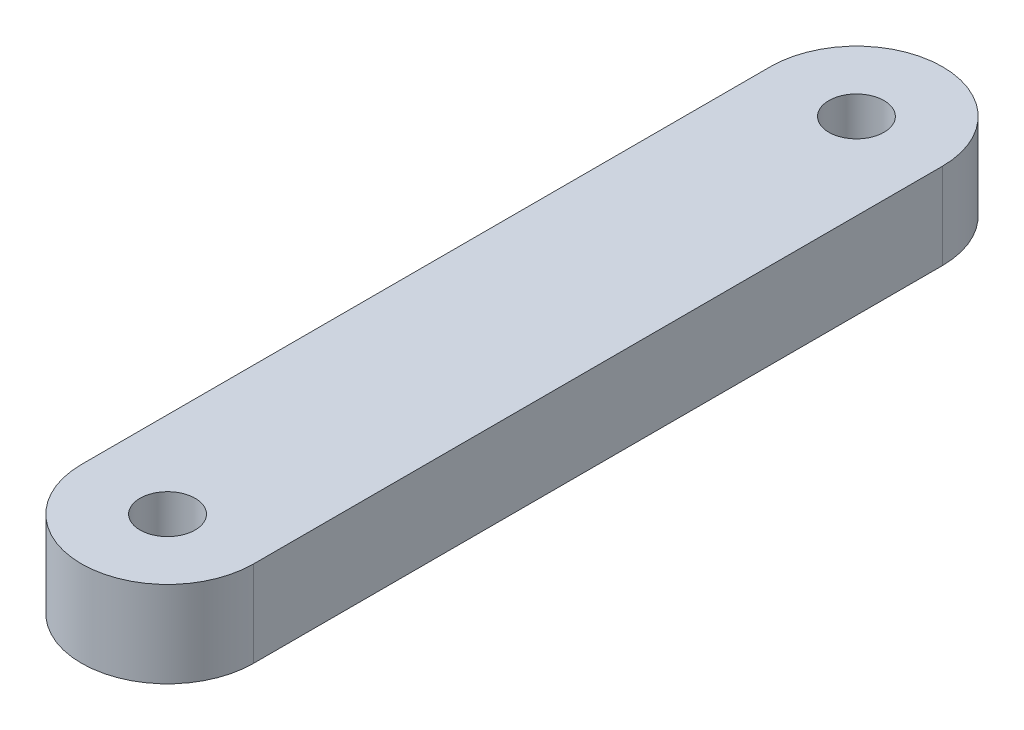
ISO-10303-21;
HEADER;
FILE_DESCRIPTION(('STEP AP214'),'2;1');
FILE_NAME('part.step','',(''),(''),'','','');
FILE_SCHEMA(('AUTOMOTIVE_DESIGN { 1 0 10303 214 1 1 1 1 }'));
ENDSEC;
DATA;
#1=APPLICATION_CONTEXT('core data for automotive mechanical design processes');
#2=APPLICATION_PROTOCOL_DEFINITION('international standard','automotive_design',2000,#1);
#3=PRODUCT_CONTEXT('',#1,'mechanical');
#4=PRODUCT('Part','Part','',(#3));
#5=PRODUCT_RELATED_PRODUCT_CATEGORY('part','',(#4));
#6=PRODUCT_DEFINITION_FORMATION('','',#4);
#7=PRODUCT_DEFINITION_CONTEXT('part definition',#1,'design');
#8=PRODUCT_DEFINITION('design','',#6,#7);
#9=PRODUCT_DEFINITION_SHAPE('','',#8);
#10=(LENGTH_UNIT() NAMED_UNIT(*) SI_UNIT(.MILLI.,.METRE.));
#11=(NAMED_UNIT(*) PLANE_ANGLE_UNIT() SI_UNIT($,.RADIAN.));
#12=(NAMED_UNIT(*) SI_UNIT($,.STERADIAN.) SOLID_ANGLE_UNIT());
#13=UNCERTAINTY_MEASURE_WITH_UNIT(LENGTH_MEASURE(1.E-05),#10,'distance_accuracy_value','');
#14=(GEOMETRIC_REPRESENTATION_CONTEXT(3) GLOBAL_UNCERTAINTY_ASSIGNED_CONTEXT((#13)) GLOBAL_UNIT_ASSIGNED_CONTEXT((#10,
#11,#12)) REPRESENTATION_CONTEXT('',''));
#15=CARTESIAN_POINT('',(0.,0.,0.));
#16=DIRECTION('',(0.,0.,1.));
#17=DIRECTION('',(1.,0.,0.));
#18=AXIS2_PLACEMENT_3D('',#15,#16,#17);
#19=CARTESIAN_POINT('',(0.,5.,0.));
#20=DIRECTION('',(0.,1.,0.));
#21=DIRECTION('',(0.,0.,1.));
#22=AXIS2_PLACEMENT_3D('',#19,#20,#21);
#23=PLANE('',#22);
#24=CARTESIAN_POINT('',(0.,5.,-40.));
#25=DIRECTION('',(0.,1.,0.));
#26=DIRECTION('',(0.,0.,1.));
#27=AXIS2_PLACEMENT_3D('',#24,#25,#26);
#28=CIRCLE('',#27,1.6);
#29=CARTESIAN_POINT('',(0.,5.,-38.4));
#30=VERTEX_POINT('',#29);
#31=EDGE_CURVE('E116',#30,#30,#28,.T.);
#32=ORIENTED_EDGE('',*,*,#31,.F.);
#33=EDGE_LOOP('',(#32));
#34=FACE_BOUND('',#33,.T.);
#35=CARTESIAN_POINT('',(0.,5.,0.));
#36=DIRECTION('',(0.,1.,0.));
#37=DIRECTION('',(0.,0.,1.));
#38=AXIS2_PLACEMENT_3D('',#35,#36,#37);
#39=CIRCLE('',#38,5.);
#40=CARTESIAN_POINT('',(-5.,5.,0.));
#41=VERTEX_POINT('',#40);
#42=CARTESIAN_POINT('',(5.,5.,0.));
#43=VERTEX_POINT('',#42);
#44=EDGE_CURVE('E96',#41,#43,#39,.T.);
#45=ORIENTED_EDGE('',*,*,#44,.T.);
#46=DIRECTION('',(0.,0.,-1.));
#47=VECTOR('',#46,1.);
#48=CARTESIAN_POINT('',(5.,5.,0.));
#49=LINE('',#48,#47);
#50=CARTESIAN_POINT('',(5.,5.,-40.));
#51=VERTEX_POINT('',#50);
#52=EDGE_CURVE('E91',#43,#51,#49,.T.);
#53=ORIENTED_EDGE('',*,*,#52,.T.);
#54=CARTESIAN_POINT('',(0.,5.,-40.));
#55=DIRECTION('',(0.,1.,0.));
#56=DIRECTION('',(0.,0.,1.));
#57=AXIS2_PLACEMENT_3D('',#54,#55,#56);
#58=CIRCLE('',#57,5.);
#59=CARTESIAN_POINT('',(-5.,5.,-40.));
#60=VERTEX_POINT('',#59);
#61=EDGE_CURVE('E94',#51,#60,#58,.T.);
#62=ORIENTED_EDGE('',*,*,#61,.T.);
#63=DIRECTION('',(0.,0.,1.));
#64=VECTOR('',#63,1.);
#65=CARTESIAN_POINT('',(-5.,5.,0.));
#66=LINE('',#65,#64);
#67=EDGE_CURVE('E61',#60,#41,#66,.T.);
#68=ORIENTED_EDGE('',*,*,#67,.T.);
#69=EDGE_LOOP('',(#45,#53,#62,#68));
#70=FACE_BOUND('',#69,.T.);
#71=CARTESIAN_POINT('',(0.,5.,0.));
#72=DIRECTION('',(0.,1.,0.));
#73=DIRECTION('',(0.,0.,1.));
#74=AXIS2_PLACEMENT_3D('',#71,#72,#73);
#75=CIRCLE('',#74,1.6);
#76=CARTESIAN_POINT('',(0.,5.,1.6));
#77=VERTEX_POINT('',#76);
#78=EDGE_CURVE('E138',#77,#77,#75,.T.);
#79=ORIENTED_EDGE('',*,*,#78,.F.);
#80=EDGE_LOOP('',(#79));
#81=FACE_BOUND('',#80,.T.);
#82=ADVANCED_FACE('F43',(#34,#70,#81),#23,.T.);
#83=CARTESIAN_POINT('',(0.,0.,0.));
#84=DIRECTION('',(0.,1.,0.));
#85=DIRECTION('',(0.,0.,1.));
#86=AXIS2_PLACEMENT_3D('',#83,#84,#85);
#87=PLANE('',#86);
#88=CARTESIAN_POINT('',(0.,0.,0.));
#89=DIRECTION('',(0.,1.,0.));
#90=DIRECTION('',(0.,0.,1.));
#91=AXIS2_PLACEMENT_3D('',#88,#89,#90);
#92=CIRCLE('',#91,5.);
#93=CARTESIAN_POINT('',(-5.,0.,0.));
#94=VERTEX_POINT('',#93);
#95=CARTESIAN_POINT('',(5.,0.,0.));
#96=VERTEX_POINT('',#95);
#97=EDGE_CURVE('E112',#94,#96,#92,.T.);
#98=ORIENTED_EDGE('',*,*,#97,.F.);
#99=DIRECTION('',(0.,0.,1.));
#100=VECTOR('',#99,1.);
#101=CARTESIAN_POINT('',(-5.,0.,0.));
#102=LINE('',#101,#100);
#103=CARTESIAN_POINT('',(-5.,0.,-40.));
#104=VERTEX_POINT('',#103);
#105=EDGE_CURVE('E84',#104,#94,#102,.T.);
#106=ORIENTED_EDGE('',*,*,#105,.F.);
#107=CARTESIAN_POINT('',(0.,0.,-40.));
#108=DIRECTION('',(0.,1.,0.));
#109=DIRECTION('',(0.,0.,1.));
#110=AXIS2_PLACEMENT_3D('',#107,#108,#109);
#111=CIRCLE('',#110,5.);
#112=CARTESIAN_POINT('',(5.,0.,-40.));
#113=VERTEX_POINT('',#112);
#114=EDGE_CURVE('E78',#113,#104,#111,.T.);
#115=ORIENTED_EDGE('',*,*,#114,.F.);
#116=DIRECTION('',(0.,0.,-1.));
#117=VECTOR('',#116,1.);
#118=CARTESIAN_POINT('',(5.,0.,0.));
#119=LINE('',#118,#117);
#120=EDGE_CURVE('E101',#96,#113,#119,.T.);
#121=ORIENTED_EDGE('',*,*,#120,.F.);
#122=EDGE_LOOP('',(#98,#106,#115,#121));
#123=FACE_BOUND('',#122,.T.);
#124=CARTESIAN_POINT('',(0.,0.,-40.));
#125=DIRECTION('',(0.,1.,0.));
#126=DIRECTION('',(0.,0.,1.));
#127=AXIS2_PLACEMENT_3D('',#124,#125,#126);
#128=CIRCLE('',#127,1.6);
#129=CARTESIAN_POINT('',(0.,0.,-38.4));
#130=VERTEX_POINT('',#129);
#131=EDGE_CURVE('E134',#130,#130,#128,.T.);
#132=ORIENTED_EDGE('',*,*,#131,.T.);
#133=EDGE_LOOP('',(#132));
#134=FACE_BOUND('',#133,.T.);
#135=CARTESIAN_POINT('',(0.,0.,0.));
#136=DIRECTION('',(0.,1.,0.));
#137=DIRECTION('',(0.,0.,1.));
#138=AXIS2_PLACEMENT_3D('',#135,#136,#137);
#139=CIRCLE('',#138,1.6);
#140=CARTESIAN_POINT('',(0.,0.,1.6));
#141=VERTEX_POINT('',#140);
#142=EDGE_CURVE('E142',#141,#141,#139,.T.);
#143=ORIENTED_EDGE('',*,*,#142,.T.);
#144=EDGE_LOOP('',(#143));
#145=FACE_BOUND('',#144,.T.);
#146=ADVANCED_FACE('F129',(#123,#134,#145),#87,.F.);
#147=CARTESIAN_POINT('',(0.,5.,0.));
#148=DIRECTION('',(0.,-1.,0.));
#149=DIRECTION('',(0.,0.,-1.));
#150=AXIS2_PLACEMENT_3D('',#147,#148,#149);
#151=CYLINDRICAL_SURFACE('',#150,5.);
#152=ORIENTED_EDGE('',*,*,#97,.T.);
#153=DIRECTION('',(0.,-1.,0.));
#154=VECTOR('',#153,1.);
#155=CARTESIAN_POINT('',(5.,5.,0.));
#156=LINE('',#155,#154);
#157=EDGE_CURVE('E11',#43,#96,#156,.T.);
#158=ORIENTED_EDGE('',*,*,#157,.F.);
#159=ORIENTED_EDGE('',*,*,#44,.F.);
#160=DIRECTION('',(0.,-1.,0.));
#161=VECTOR('',#160,1.);
#162=CARTESIAN_POINT('',(-5.,5.,0.));
#163=LINE('',#162,#161);
#164=EDGE_CURVE('E108',#41,#94,#163,.T.);
#165=ORIENTED_EDGE('',*,*,#164,.T.);
#166=EDGE_LOOP('',(#152,#158,#159,#165));
#167=FACE_BOUND('',#166,.T.);
#168=ADVANCED_FACE('F45',(#167),#151,.T.);
#169=CARTESIAN_POINT('',(5.,5.,0.));
#170=DIRECTION('',(-1.,0.,0.));
#171=DIRECTION('',(0.,0.,1.));
#172=AXIS2_PLACEMENT_3D('',#169,#170,#171);
#173=PLANE('',#172);
#174=ORIENTED_EDGE('',*,*,#120,.T.);
#175=DIRECTION('',(0.,-1.,0.));
#176=VECTOR('',#175,1.);
#177=CARTESIAN_POINT('',(5.,5.,-40.));
#178=LINE('',#177,#176);
#179=EDGE_CURVE('E53',#51,#113,#178,.T.);
#180=ORIENTED_EDGE('',*,*,#179,.F.);
#181=ORIENTED_EDGE('',*,*,#52,.F.);
#182=ORIENTED_EDGE('',*,*,#157,.T.);
#183=EDGE_LOOP('',(#174,#180,#181,#182));
#184=FACE_BOUND('',#183,.T.);
#185=ADVANCED_FACE('F100',(#184),#173,.F.);
#186=CARTESIAN_POINT('',(0.,5.,-40.));
#187=DIRECTION('',(0.,-1.,0.));
#188=DIRECTION('',(0.,0.,-1.));
#189=AXIS2_PLACEMENT_3D('',#186,#187,#188);
#190=CYLINDRICAL_SURFACE('',#189,5.);
#191=ORIENTED_EDGE('',*,*,#114,.T.);
#192=DIRECTION('',(0.,-1.,0.));
#193=VECTOR('',#192,1.);
#194=CARTESIAN_POINT('',(-5.,5.,-40.));
#195=LINE('',#194,#193);
#196=EDGE_CURVE('E103',#60,#104,#195,.T.);
#197=ORIENTED_EDGE('',*,*,#196,.F.);
#198=ORIENTED_EDGE('',*,*,#61,.F.);
#199=ORIENTED_EDGE('',*,*,#179,.T.);
#200=EDGE_LOOP('',(#191,#197,#198,#199));
#201=FACE_BOUND('',#200,.T.);
#202=ADVANCED_FACE('F104',(#201),#190,.T.);
#203=CARTESIAN_POINT('',(-5.,5.,0.));
#204=DIRECTION('',(1.,0.,0.));
#205=DIRECTION('',(0.,0.,-1.));
#206=AXIS2_PLACEMENT_3D('',#203,#204,#205);
#207=PLANE('',#206);
#208=ORIENTED_EDGE('',*,*,#105,.T.);
#209=ORIENTED_EDGE('',*,*,#164,.F.);
#210=ORIENTED_EDGE('',*,*,#67,.F.);
#211=ORIENTED_EDGE('',*,*,#196,.T.);
#212=EDGE_LOOP('',(#208,#209,#210,#211));
#213=FACE_BOUND('',#212,.T.);
#214=ADVANCED_FACE('F126',(#213),#207,.F.);
#215=CARTESIAN_POINT('',(0.,5.,-40.));
#216=DIRECTION('',(0.,-1.,0.));
#217=DIRECTION('',(0.,0.,-1.));
#218=AXIS2_PLACEMENT_3D('',#215,#216,#217);
#219=CYLINDRICAL_SURFACE('',#218,1.6);
#220=ORIENTED_EDGE('',*,*,#31,.T.);
#221=EDGE_LOOP('',(#220));
#222=FACE_BOUND('',#221,.T.);
#223=ORIENTED_EDGE('',*,*,#131,.F.);
#224=EDGE_LOOP('',(#223));
#225=FACE_BOUND('',#224,.T.);
#226=ADVANCED_FACE('F161',(#222,#225),#219,.F.);
#227=CARTESIAN_POINT('',(0.,5.,0.));
#228=DIRECTION('',(0.,-1.,0.));
#229=DIRECTION('',(0.,0.,-1.));
#230=AXIS2_PLACEMENT_3D('',#227,#228,#229);
#231=CYLINDRICAL_SURFACE('',#230,1.6);
#232=ORIENTED_EDGE('',*,*,#78,.T.);
#233=EDGE_LOOP('',(#232));
#234=FACE_BOUND('',#233,.T.);
#235=ORIENTED_EDGE('',*,*,#142,.F.);
#236=EDGE_LOOP('',(#235));
#237=FACE_BOUND('',#236,.T.);
#238=ADVANCED_FACE('F150',(#234,#237),#231,.F.);
#239=CLOSED_SHELL('',(#82,#146,#168,#185,#202,#214,#226,#238));
#240=MANIFOLD_SOLID_BREP('B2',#239);
#241=ADVANCED_BREP_SHAPE_REPRESENTATION('',(#18,#240),#14);
#242=SHAPE_DEFINITION_REPRESENTATION(#9,#241);
ENDSEC;
END-ISO-10303-21;
